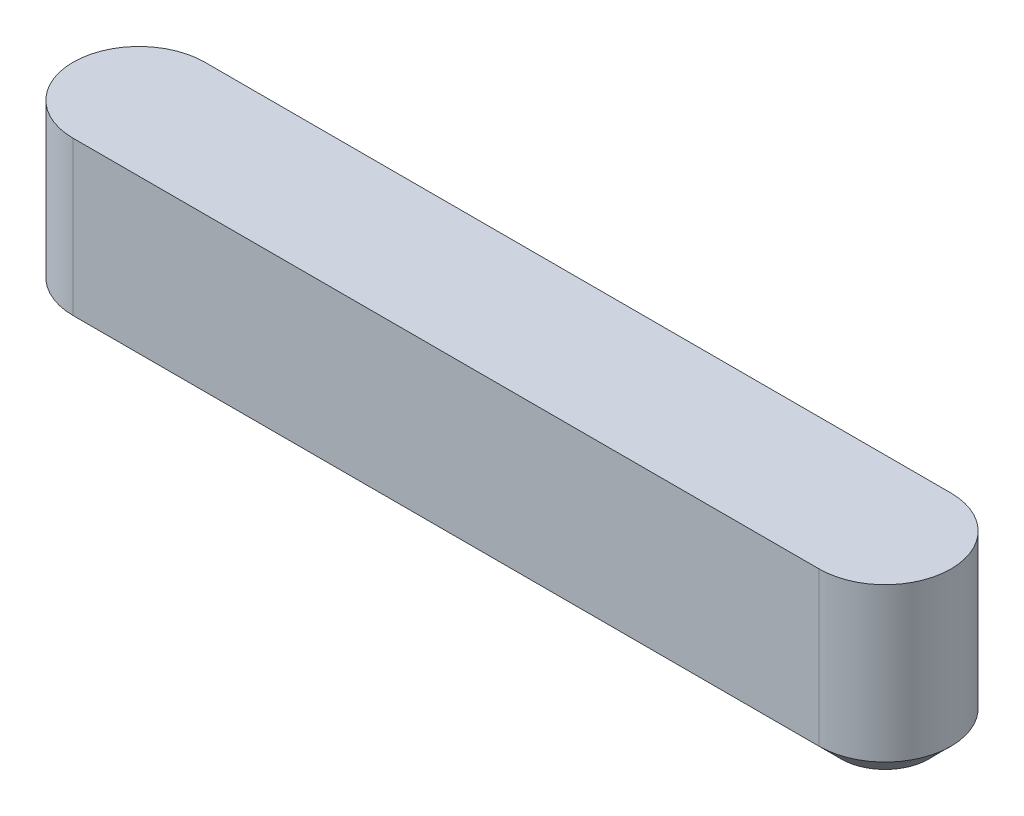
ISO-10303-21;
HEADER;
FILE_DESCRIPTION(('STEP AP214'),'2;1');
FILE_NAME('part.step','',(''),(''),'','','');
FILE_SCHEMA(('AUTOMOTIVE_DESIGN { 1 0 10303 214 1 1 1 1 }'));
ENDSEC;
DATA;
#1=APPLICATION_CONTEXT('core data for automotive mechanical design processes');
#2=APPLICATION_PROTOCOL_DEFINITION('international standard','automotive_design',2000,#1);
#3=PRODUCT_CONTEXT('',#1,'mechanical');
#4=PRODUCT('Part','Part','',(#3));
#5=PRODUCT_RELATED_PRODUCT_CATEGORY('part','',(#4));
#6=PRODUCT_DEFINITION_FORMATION('','',#4);
#7=PRODUCT_DEFINITION_CONTEXT('part definition',#1,'design');
#8=PRODUCT_DEFINITION('design','',#6,#7);
#9=PRODUCT_DEFINITION_SHAPE('','',#8);
#10=(LENGTH_UNIT() NAMED_UNIT(*) SI_UNIT(.MILLI.,.METRE.));
#11=(NAMED_UNIT(*) PLANE_ANGLE_UNIT() SI_UNIT($,.RADIAN.));
#12=(NAMED_UNIT(*) SI_UNIT($,.STERADIAN.) SOLID_ANGLE_UNIT());
#13=UNCERTAINTY_MEASURE_WITH_UNIT(LENGTH_MEASURE(1.E-05),#10,'distance_accuracy_value','');
#14=(GEOMETRIC_REPRESENTATION_CONTEXT(3) GLOBAL_UNCERTAINTY_ASSIGNED_CONTEXT((#13)) GLOBAL_UNIT_ASSIGNED_CONTEXT((#10,
#11,#12)) REPRESENTATION_CONTEXT('',''));
#15=CARTESIAN_POINT('',(0.,0.,0.));
#16=DIRECTION('',(0.,0.,1.));
#17=DIRECTION('',(1.,0.,0.));
#18=AXIS2_PLACEMENT_3D('',#15,#16,#17);
#19=CARTESIAN_POINT('',(8.5,4.,0.));
#20=DIRECTION('',(0.,-1.,0.));
#21=DIRECTION('',(0.,0.,-1.));
#22=AXIS2_PLACEMENT_3D('',#19,#20,#21);
#23=CYLINDRICAL_SURFACE('',#22,1.5);
#24=DIRECTION('',(0.,-1.,0.));
#25=VECTOR('',#24,1.);
#26=CARTESIAN_POINT('',(8.5,4.,1.5));
#27=LINE('',#26,#25);
#28=CARTESIAN_POINT('',(8.5,4.,1.5));
#29=VERTEX_POINT('',#28);
#30=CARTESIAN_POINT('',(8.5,0.500000000000002,1.5));
#31=VERTEX_POINT('',#30);
#32=EDGE_CURVE('E174',#29,#31,#27,.T.);
#33=ORIENTED_EDGE('',*,*,#32,.T.);
#34=CARTESIAN_POINT('',(8.5,0.500000000000002,0.));
#35=DIRECTION('',(0.,1.,0.));
#36=DIRECTION('',(0.,0.,1.));
#37=AXIS2_PLACEMENT_3D('',#34,#35,#36);
#38=CIRCLE('',#37,1.5);
#39=CARTESIAN_POINT('',(8.50000000000001,0.500000000000002,-1.5));
#40=VERTEX_POINT('',#39);
#41=EDGE_CURVE('E66',#31,#40,#38,.T.);
#42=ORIENTED_EDGE('',*,*,#41,.T.);
#43=DIRECTION('',(0.,-1.,0.));
#44=VECTOR('',#43,1.);
#45=CARTESIAN_POINT('',(8.50000000000001,4.,-1.5));
#46=LINE('',#45,#44);
#47=CARTESIAN_POINT('',(8.50000000000001,4.,-1.5));
#48=VERTEX_POINT('',#47);
#49=EDGE_CURVE('E99',#48,#40,#46,.T.);
#50=ORIENTED_EDGE('',*,*,#49,.F.);
#51=CARTESIAN_POINT('',(8.5,4.,0.));
#52=DIRECTION('',(0.,1.,0.));
#53=DIRECTION('',(0.,0.,1.));
#54=AXIS2_PLACEMENT_3D('',#51,#52,#53);
#55=CIRCLE('',#54,1.5);
#56=EDGE_CURVE('E105',#29,#48,#55,.T.);
#57=ORIENTED_EDGE('',*,*,#56,.F.);
#58=EDGE_LOOP('',(#33,#42,#50,#57));
#59=FACE_BOUND('',#58,.T.);
#60=ADVANCED_FACE('F41',(#59),#23,.T.);
#61=CARTESIAN_POINT('',(-8.49999999999999,4.,-1.5));
#62=DIRECTION('',(0.,0.,1.));
#63=DIRECTION('',(1.,0.,0.));
#64=AXIS2_PLACEMENT_3D('',#61,#62,#63);
#65=PLANE('',#64);
#66=ORIENTED_EDGE('',*,*,#49,.T.);
#67=DIRECTION('',(-1.,0.,0.));
#68=VECTOR('',#67,1.);
#69=CARTESIAN_POINT('',(-8.49999999999999,0.500000000000002,-1.5));
#70=LINE('',#69,#68);
#71=CARTESIAN_POINT('',(-8.49999999999999,0.500000000000002,-1.5));
#72=VERTEX_POINT('',#71);
#73=EDGE_CURVE('E11',#40,#72,#70,.T.);
#74=ORIENTED_EDGE('',*,*,#73,.T.);
#75=DIRECTION('',(0.,-1.,0.));
#76=VECTOR('',#75,1.);
#77=CARTESIAN_POINT('',(-8.49999999999999,4.,-1.5));
#78=LINE('',#77,#76);
#79=CARTESIAN_POINT('',(-8.49999999999999,4.,-1.5));
#80=VERTEX_POINT('',#79);
#81=EDGE_CURVE('E100',#80,#72,#78,.T.);
#82=ORIENTED_EDGE('',*,*,#81,.F.);
#83=DIRECTION('',(-1.,0.,0.));
#84=VECTOR('',#83,1.);
#85=CARTESIAN_POINT('',(-8.49999999999999,4.,-1.5));
#86=LINE('',#85,#84);
#87=EDGE_CURVE('E96',#48,#80,#86,.T.);
#88=ORIENTED_EDGE('',*,*,#87,.F.);
#89=EDGE_LOOP('',(#66,#74,#82,#88));
#90=FACE_BOUND('',#89,.T.);
#91=ADVANCED_FACE('F98',(#90),#65,.F.);
#92=CARTESIAN_POINT('',(-8.5,4.,0.));
#93=DIRECTION('',(0.,-1.,0.));
#94=DIRECTION('',(0.,0.,-1.));
#95=AXIS2_PLACEMENT_3D('',#92,#93,#94);
#96=CYLINDRICAL_SURFACE('',#95,1.5);
#97=ORIENTED_EDGE('',*,*,#81,.T.);
#98=CARTESIAN_POINT('',(-8.5,0.500000000000002,0.));
#99=DIRECTION('',(0.,1.,0.));
#100=DIRECTION('',(0.,0.,1.));
#101=AXIS2_PLACEMENT_3D('',#98,#99,#100);
#102=CIRCLE('',#101,1.5);
#103=CARTESIAN_POINT('',(-8.5,0.500000000000002,1.5));
#104=VERTEX_POINT('',#103);
#105=EDGE_CURVE('E52',#72,#104,#102,.T.);
#106=ORIENTED_EDGE('',*,*,#105,.T.);
#107=DIRECTION('',(0.,-1.,0.));
#108=VECTOR('',#107,1.);
#109=CARTESIAN_POINT('',(-8.5,4.,1.5));
#110=LINE('',#109,#108);
#111=CARTESIAN_POINT('',(-8.5,4.,1.5));
#112=VERTEX_POINT('',#111);
#113=EDGE_CURVE('E122',#112,#104,#110,.T.);
#114=ORIENTED_EDGE('',*,*,#113,.F.);
#115=CARTESIAN_POINT('',(-8.5,4.,0.));
#116=DIRECTION('',(0.,1.,0.));
#117=DIRECTION('',(0.,0.,1.));
#118=AXIS2_PLACEMENT_3D('',#115,#116,#117);
#119=CIRCLE('',#118,1.5);
#120=EDGE_CURVE('E104',#80,#112,#119,.T.);
#121=ORIENTED_EDGE('',*,*,#120,.F.);
#122=EDGE_LOOP('',(#97,#106,#114,#121));
#123=FACE_BOUND('',#122,.T.);
#124=ADVANCED_FACE('F184',(#123),#96,.T.);
#125=CARTESIAN_POINT('',(-8.5,4.,1.5));
#126=DIRECTION('',(0.,0.,-1.));
#127=DIRECTION('',(-1.,0.,0.));
#128=AXIS2_PLACEMENT_3D('',#125,#126,#127);
#129=PLANE('',#128);
#130=ORIENTED_EDGE('',*,*,#113,.T.);
#131=DIRECTION('',(1.,0.,0.));
#132=VECTOR('',#131,1.);
#133=CARTESIAN_POINT('',(-8.5,0.500000000000002,1.5));
#134=LINE('',#133,#132);
#135=EDGE_CURVE('E115',#104,#31,#134,.T.);
#136=ORIENTED_EDGE('',*,*,#135,.T.);
#137=ORIENTED_EDGE('',*,*,#32,.F.);
#138=DIRECTION('',(1.,0.,0.));
#139=VECTOR('',#138,1.);
#140=CARTESIAN_POINT('',(-8.5,4.,1.5));
#141=LINE('',#140,#139);
#142=EDGE_CURVE('E110',#112,#29,#141,.T.);
#143=ORIENTED_EDGE('',*,*,#142,.F.);
#144=EDGE_LOOP('',(#130,#136,#137,#143));
#145=FACE_BOUND('',#144,.T.);
#146=ADVANCED_FACE('F173',(#145),#129,.F.);
#147=CARTESIAN_POINT('',(8.5,4.,0.));
#148=DIRECTION('',(0.,1.,0.));
#149=DIRECTION('',(0.,0.,1.));
#150=AXIS2_PLACEMENT_3D('',#147,#148,#149);
#151=PLANE('',#150);
#152=ORIENTED_EDGE('',*,*,#56,.T.);
#153=ORIENTED_EDGE('',*,*,#87,.T.);
#154=ORIENTED_EDGE('',*,*,#120,.T.);
#155=ORIENTED_EDGE('',*,*,#142,.T.);
#156=EDGE_LOOP('',(#152,#153,#154,#155));
#157=FACE_BOUND('',#156,.T.);
#158=ADVANCED_FACE('F108',(#157),#151,.T.);
#159=CARTESIAN_POINT('',(8.5,0.,0.));
#160=DIRECTION('',(0.,1.,0.));
#161=DIRECTION('',(0.,0.,1.));
#162=AXIS2_PLACEMENT_3D('',#159,#160,#161);
#163=PLANE('',#162);
#164=CARTESIAN_POINT('',(8.5,0.,0.));
#165=DIRECTION('',(0.,1.,0.));
#166=DIRECTION('',(0.,0.,1.));
#167=AXIS2_PLACEMENT_3D('',#164,#165,#166);
#168=CIRCLE('',#167,0.999999999999995);
#169=CARTESIAN_POINT('',(8.50000000000001,0.,-0.999999999999994));
#170=VERTEX_POINT('',#169);
#171=CARTESIAN_POINT('',(8.5,0.,0.999999999999996));
#172=VERTEX_POINT('',#171);
#173=EDGE_CURVE('E131',#170,#172,#168,.F.);
#174=ORIENTED_EDGE('',*,*,#173,.T.);
#175=DIRECTION('',(-1.,0.,0.));
#176=VECTOR('',#175,1.);
#177=CARTESIAN_POINT('',(8.5,0.,0.999999999999996));
#178=LINE('',#177,#176);
#179=CARTESIAN_POINT('',(-8.5,0.,0.999999999999995));
#180=VERTEX_POINT('',#179);
#181=EDGE_CURVE('E134',#172,#180,#178,.T.);
#182=ORIENTED_EDGE('',*,*,#181,.T.);
#183=CARTESIAN_POINT('',(-8.5,0.,0.));
#184=DIRECTION('',(0.,1.,0.));
#185=DIRECTION('',(0.,0.,1.));
#186=AXIS2_PLACEMENT_3D('',#183,#184,#185);
#187=CIRCLE('',#186,0.999999999999994);
#188=CARTESIAN_POINT('',(-8.49999999999999,0.,-0.999999999999994));
#189=VERTEX_POINT('',#188);
#190=EDGE_CURVE('E128',#180,#189,#187,.F.);
#191=ORIENTED_EDGE('',*,*,#190,.T.);
#192=DIRECTION('',(1.,0.,0.));
#193=VECTOR('',#192,1.);
#194=CARTESIAN_POINT('',(8.5,0.,-0.999999999999994));
#195=LINE('',#194,#193);
#196=EDGE_CURVE('E120',#189,#170,#195,.T.);
#197=ORIENTED_EDGE('',*,*,#196,.T.);
#198=EDGE_LOOP('',(#174,#182,#191,#197));
#199=FACE_BOUND('',#198,.T.);
#200=ADVANCED_FACE('F164',(#199),#163,.F.);
#201=CARTESIAN_POINT('',(-8.49999999999999,0.500000000000002,-1.5));
#202=DIRECTION('',(0.,0.70710678118655,0.707106781186545));
#203=DIRECTION('',(-1.,0.,0.));
#204=AXIS2_PLACEMENT_3D('',#201,#202,#203);
#205=PLANE('',#204);
#206=DIRECTION('',(0.,0.707106781186545,-0.70710678118655));
#207=VECTOR('',#206,1.);
#208=CARTESIAN_POINT('',(8.50000000000001,0.,-0.999999999999994));
#209=LINE('',#208,#207);
#210=EDGE_CURVE('E147',#170,#40,#209,.T.);
#211=ORIENTED_EDGE('',*,*,#210,.F.);
#212=ORIENTED_EDGE('',*,*,#196,.F.);
#213=DIRECTION('',(0.,-0.707106781186545,0.70710678118655));
#214=VECTOR('',#213,1.);
#215=CARTESIAN_POINT('',(-8.49999999999999,0.500000000000002,-1.5));
#216=LINE('',#215,#214);
#217=EDGE_CURVE('E46',#72,#189,#216,.T.);
#218=ORIENTED_EDGE('',*,*,#217,.F.);
#219=ORIENTED_EDGE('',*,*,#73,.F.);
#220=EDGE_LOOP('',(#211,#212,#218,#219));
#221=FACE_BOUND('',#220,.T.);
#222=ADVANCED_FACE('F44',(#221),#205,.F.);
#223=CARTESIAN_POINT('',(-8.5,0.500000000000002,0.));
#224=DIRECTION('',(0.,1.,0.));
#225=DIRECTION('',(0.,0.,1.));
#226=AXIS2_PLACEMENT_3D('',#223,#224,#225);
#227=CONICAL_SURFACE('',#226,1.5,0.785398163397452);
#228=ORIENTED_EDGE('',*,*,#217,.T.);
#229=ORIENTED_EDGE('',*,*,#190,.F.);
#230=DIRECTION('',(0.,-0.707106781186545,-0.70710678118655));
#231=VECTOR('',#230,1.);
#232=CARTESIAN_POINT('',(-8.5,0.500000000000002,1.5));
#233=LINE('',#232,#231);
#234=EDGE_CURVE('E145',#104,#180,#233,.T.);
#235=ORIENTED_EDGE('',*,*,#234,.F.);
#236=ORIENTED_EDGE('',*,*,#105,.F.);
#237=EDGE_LOOP('',(#228,#229,#235,#236));
#238=FACE_BOUND('',#237,.T.);
#239=ADVANCED_FACE('F159',(#238),#227,.T.);
#240=CARTESIAN_POINT('',(8.5,0.500000000000002,0.));
#241=DIRECTION('',(0.,1.,0.));
#242=DIRECTION('',(0.,0.,1.));
#243=AXIS2_PLACEMENT_3D('',#240,#241,#242);
#244=CONICAL_SURFACE('',#243,1.5,0.785398163397452);
#245=ORIENTED_EDGE('',*,*,#210,.T.);
#246=ORIENTED_EDGE('',*,*,#41,.F.);
#247=DIRECTION('',(0.,0.707106781186545,0.70710678118655));
#248=VECTOR('',#247,1.);
#249=CARTESIAN_POINT('',(8.5,0.,0.999999999999996));
#250=LINE('',#249,#248);
#251=EDGE_CURVE('E142',#172,#31,#250,.T.);
#252=ORIENTED_EDGE('',*,*,#251,.F.);
#253=ORIENTED_EDGE('',*,*,#173,.F.);
#254=EDGE_LOOP('',(#245,#246,#252,#253));
#255=FACE_BOUND('',#254,.T.);
#256=ADVANCED_FACE('F170',(#255),#244,.T.);
#257=CARTESIAN_POINT('',(-8.5,0.500000000000002,1.5));
#258=DIRECTION('',(0.,0.70710678118655,-0.707106781186545));
#259=DIRECTION('',(1.,0.,0.));
#260=AXIS2_PLACEMENT_3D('',#257,#258,#259);
#261=PLANE('',#260);
#262=ORIENTED_EDGE('',*,*,#234,.T.);
#263=ORIENTED_EDGE('',*,*,#181,.F.);
#264=ORIENTED_EDGE('',*,*,#251,.T.);
#265=ORIENTED_EDGE('',*,*,#135,.F.);
#266=EDGE_LOOP('',(#262,#263,#264,#265));
#267=FACE_BOUND('',#266,.T.);
#268=ADVANCED_FACE('F168',(#267),#261,.F.);
#269=CLOSED_SHELL('',(#60,#91,#124,#146,#158,#200,#222,#239,#256,#268));
#270=MANIFOLD_SOLID_BREP('B2',#269);
#271=ADVANCED_BREP_SHAPE_REPRESENTATION('',(#18,#270),#14);
#272=SHAPE_DEFINITION_REPRESENTATION(#9,#271);
ENDSEC;
END-ISO-10303-21;
